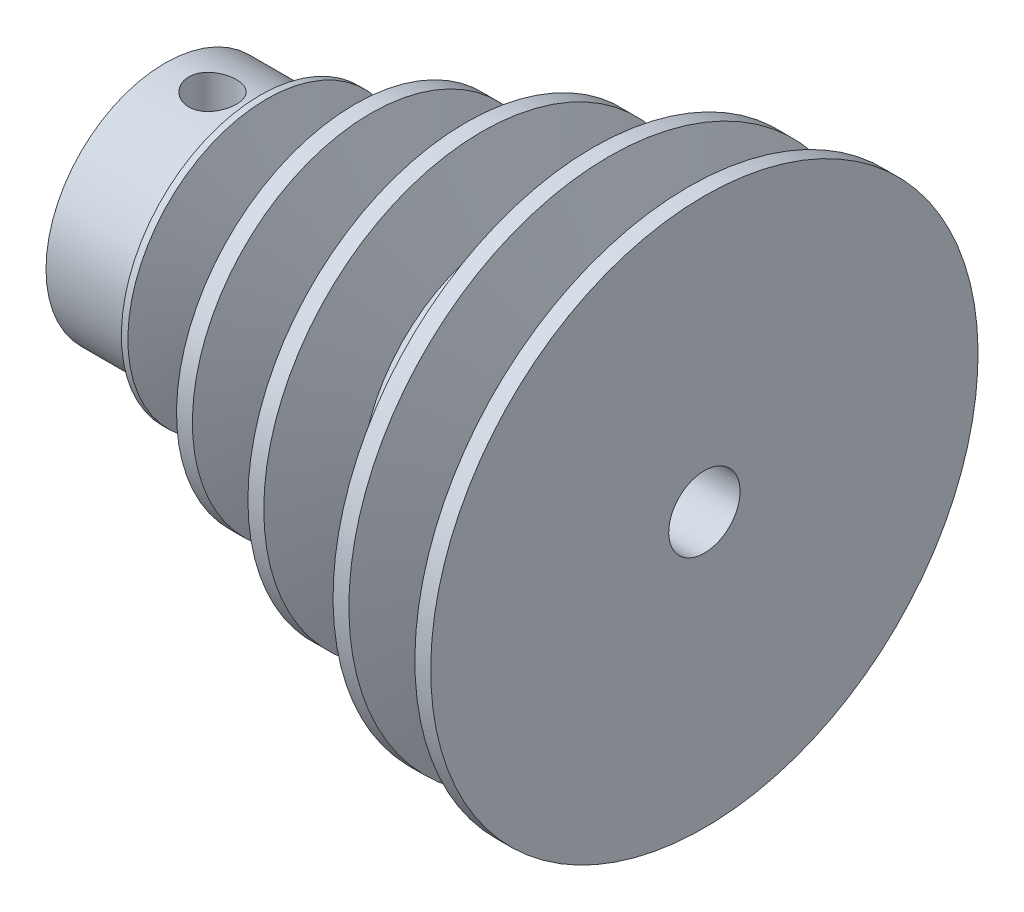
ISO-10303-21;
HEADER;
FILE_DESCRIPTION(('STEP AP214'),'2;1');
FILE_NAME('part.step','',(''),(''),'','','');
FILE_SCHEMA(('AUTOMOTIVE_DESIGN { 1 0 10303 214 1 1 1 1 }'));
ENDSEC;
DATA;
#1=APPLICATION_CONTEXT('core data for automotive mechanical design processes');
#2=APPLICATION_PROTOCOL_DEFINITION('international standard','automotive_design',2000,#1);
#3=PRODUCT_CONTEXT('',#1,'mechanical');
#4=PRODUCT('Part','Part','',(#3));
#5=PRODUCT_RELATED_PRODUCT_CATEGORY('part','',(#4));
#6=PRODUCT_DEFINITION_FORMATION('','',#4);
#7=PRODUCT_DEFINITION_CONTEXT('part definition',#1,'design');
#8=PRODUCT_DEFINITION('design','',#6,#7);
#9=PRODUCT_DEFINITION_SHAPE('','',#8);
#10=(LENGTH_UNIT() NAMED_UNIT(*) SI_UNIT(.MILLI.,.METRE.));
#11=(NAMED_UNIT(*) PLANE_ANGLE_UNIT() SI_UNIT($,.RADIAN.));
#12=(NAMED_UNIT(*) SI_UNIT($,.STERADIAN.) SOLID_ANGLE_UNIT());
#13=UNCERTAINTY_MEASURE_WITH_UNIT(LENGTH_MEASURE(1.E-05),#10,'distance_accuracy_value','');
#14=(GEOMETRIC_REPRESENTATION_CONTEXT(3) GLOBAL_UNCERTAINTY_ASSIGNED_CONTEXT((#13)) GLOBAL_UNIT_ASSIGNED_CONTEXT((#10,
#11,#12)) REPRESENTATION_CONTEXT('',''));
#15=CARTESIAN_POINT('',(0.,0.,0.));
#16=DIRECTION('',(0.,0.,1.));
#17=DIRECTION('',(1.,0.,0.));
#18=AXIS2_PLACEMENT_3D('',#15,#16,#17);
#19=CARTESIAN_POINT('',(0.,1.23931272015943,0.));
#20=DIRECTION('',(1.,0.,0.));
#21=DIRECTION('',(0.,1.,0.));
#22=AXIS2_PLACEMENT_3D('',#19,#20,#21);
#23=CYLINDRICAL_SURFACE('',#22,4.5);
#24=CARTESIAN_POINT('',(0.,1.23931272015943,0.));
#25=DIRECTION('',(1.,0.,0.));
#26=DIRECTION('',(0.,1.,0.));
#27=AXIS2_PLACEMENT_3D('',#24,#25,#26);
#28=CIRCLE('',#27,4.5);
#29=CARTESIAN_POINT('',(0.,5.73931272015943,0.));
#30=VERTEX_POINT('',#29);
#31=EDGE_CURVE('E10',#30,#30,#28,.T.);
#32=ORIENTED_EDGE('',*,*,#31,.F.);
#33=EDGE_LOOP('',(#32));
#34=FACE_BOUND('',#33,.T.);
#35=CARTESIAN_POINT('',(68.,1.23931272015944,0.));
#36=DIRECTION('',(1.,0.,0.));
#37=DIRECTION('',(0.,1.,0.));
#38=AXIS2_PLACEMENT_3D('',#35,#36,#37);
#39=CIRCLE('',#38,4.49999999999999);
#40=CARTESIAN_POINT('',(68.,5.73931272015943,0.));
#41=VERTEX_POINT('',#40);
#42=EDGE_CURVE('E51',#41,#41,#39,.T.);
#43=ORIENTED_EDGE('',*,*,#42,.T.);
#44=EDGE_LOOP('',(#43));
#45=FACE_BOUND('',#44,.T.);
#46=CARTESIAN_POINT('',(3.,5.73931272015943,0.));
#47=CARTESIAN_POINT('',(3.00000186573508,5.73931123886889,0.15072164959947));
#48=CARTESIAN_POINT('',(3.01142167582322,5.73167419712419,0.301452176851333));
#49=CARTESIAN_POINT('',(3.05639457492619,5.7018830711206,0.59810104158593));
#50=CARTESIAN_POINT('',(3.08995817181012,5.67972209486661,0.744017059910981));
#51=CARTESIAN_POINT('',(3.17716176796593,5.62306980594291,1.02631807461021));
#52=CARTESIAN_POINT('',(3.23070776159686,5.58863626217678,1.16274420495288));
#53=CARTESIAN_POINT('',(3.35559499331481,5.51020482870927,1.42412304054445));
#54=CARTESIAN_POINT('',(3.42693881510055,5.46620555047596,1.54907407635533));
#55=CARTESIAN_POINT('',(3.59198542161917,5.36772264851983,1.7959270197585));
#56=CARTESIAN_POINT('',(3.68707179530865,5.31266618056573,1.91667044973221));
#57=CARTESIAN_POINT('',(3.89359506878731,5.19904741969964,2.14159207551014));
#58=CARTESIAN_POINT('',(4.00505539355606,5.14048017645192,2.24574608557946));
#59=CARTESIAN_POINT('',(4.26157855280895,5.01523668925303,2.45133446337936));
#60=CARTESIAN_POINT('',(4.40916848017331,4.94873873893729,2.54974779469906));
#61=CARTESIAN_POINT('',(4.72254506610231,4.82557493074029,2.72025535595352));
#62=CARTESIAN_POINT('',(4.88829960226053,4.76889215954816,2.79239510156523));
#63=CARTESIAN_POINT('',(5.18506694019189,4.68895671973245,2.8901105250523));
#64=CARTESIAN_POINT('',(5.31229267932842,4.66077713852416,2.92311670850673));
#65=CARTESIAN_POINT('',(5.57211675709495,4.61818226507475,2.97225926681176));
#66=CARTESIAN_POINT('',(5.70470542307829,4.60374325135791,2.9884247197938));
#67=CARTESIAN_POINT('',(5.97221216829555,4.59086180424368,3.002870462104));
#68=CARTESIAN_POINT('',(6.10713753520439,4.5924847584124,3.00107764373871));
#69=CARTESIAN_POINT('',(6.37445246022382,4.61160935253547,2.97956372002451));
#70=CARTESIAN_POINT('',(6.50683977294976,4.62912444492503,2.95982742578818));
#71=CARTESIAN_POINT('',(6.75970057696874,4.6762205095701,2.90497491317742));
#72=CARTESIAN_POINT('',(6.88044200426452,4.70523504341825,2.87057567189679));
#73=CARTESIAN_POINT('',(7.11453553681584,4.77195706253868,2.78805177845537));
#74=CARTESIAN_POINT('',(7.22788519545557,4.80966740750797,2.73992260984511));
#75=CARTESIAN_POINT('',(7.46853809290249,4.89877566639455,2.62010728109712));
#76=CARTESIAN_POINT('',(7.59398985068898,4.95139748642152,2.54562078453565));
#77=CARTESIAN_POINT('',(7.83207509296433,5.0596857860081,2.3800344065443));
#78=CARTESIAN_POINT('',(7.94469248665353,5.11535596075473,2.28891403498575));
#79=CARTESIAN_POINT('',(8.17881381839246,5.23746287666952,2.06971747984493));
#80=CARTESIAN_POINT('',(8.29700107302078,5.30363389098225,1.93790907425758));
#81=CARTESIAN_POINT('',(8.50979474181109,5.42758423012319,1.65301199861739));
#82=CARTESIAN_POINT('',(8.60442321811428,5.48537138487659,1.49994344901489));
#83=CARTESIAN_POINT('',(8.75021657793366,5.57649378151768,1.20728674064533));
#84=CARTESIAN_POINT('',(8.80626504500823,5.61240163764327,1.07093646505802));
#85=CARTESIAN_POINT('',(8.89815738843823,5.67192850561616,0.789054065903088));
#86=CARTESIAN_POINT('',(8.93401834069837,5.69555790207238,0.643529818502444));
#87=CARTESIAN_POINT('',(8.98374174785695,5.72845095251175,0.346478179758469));
#88=CARTESIAN_POINT('',(8.99750919140739,5.73765255707728,0.194927717901261));
#89=CARTESIAN_POINT('',(9.00187063284333,5.74055944463657,-0.108662279084028));
#90=CARTESIAN_POINT('',(8.99246625073317,5.73426581094392,-0.260701779279956));
#91=CARTESIAN_POINT('',(8.95256391665706,5.70780656152354,-0.549683575806327));
#92=CARTESIAN_POINT('',(8.92359405336714,5.68864641601284,-0.686936167018703));
#93=CARTESIAN_POINT('',(8.84760647098074,5.63908945943196,-0.954174588641173));
#94=CARTESIAN_POINT('',(8.8005858736078,5.6086908563642,-1.08415925635699));
#95=CARTESIAN_POINT('',(8.68702155443251,5.53675800809685,-1.34199712569868));
#96=CARTESIAN_POINT('',(8.61946776887679,5.49466077219643,-1.46924427694593));
#97=CARTESIAN_POINT('',(8.46835006508103,5.40334055433186,-1.71102453593712));
#98=CARTESIAN_POINT('',(8.38477625920337,5.35411317621769,-1.82554972230581));
#99=CARTESIAN_POINT('',(8.18908819776187,5.24363091996186,-2.0577816822297));
#100=CARTESIAN_POINT('',(8.07455060987987,5.18170507216583,-2.17312781352281));
#101=CARTESIAN_POINT('',(7.82833285507184,5.05788031644486,-2.3840095210624));
#102=CARTESIAN_POINT('',(7.69664094136692,4.99598145641237,-2.479531404936));
#103=CARTESIAN_POINT('',(7.42928638082203,4.88340790473161,-2.6418716481687));
#104=CARTESIAN_POINT('',(7.2949019497142,4.83222667559331,-2.71043454162459));
#105=CARTESIAN_POINT('',(7.0141910214269,4.74089733410347,-2.82744320635816));
#106=CARTESIAN_POINT('',(6.86788659288638,4.70072940792725,-2.87592518617797));
#107=CARTESIAN_POINT('',(6.59315326892533,4.64331084304613,-2.94353765120495));
#108=CARTESIAN_POINT('',(6.46624228422316,4.62323769098172,-2.96637896084263));
#109=CARTESIAN_POINT('',(6.20914007898423,4.5975047162325,-2.99548809149845));
#110=CARTESIAN_POINT('',(6.0789525768549,4.59182923851309,-3.00177391409198));
#111=CARTESIAN_POINT('',(5.81903541134822,4.59577573927382,-2.99735881990096));
#112=CARTESIAN_POINT('',(5.68930606463311,4.60540677572879,-2.98664784488398));
#113=CARTESIAN_POINT('',(5.43398472052587,4.63846949924508,-2.94895499505287));
#114=CARTESIAN_POINT('',(5.30839847901947,4.66191959705786,-2.9219514129043));
#115=CARTESIAN_POINT('',(5.03143315726411,4.72721541167946,-2.84389536138181));
#116=CARTESIAN_POINT('',(4.88209816631783,4.772297861961,-2.78835207942162));
#117=CARTESIAN_POINT('',(4.5967700130633,4.8726449986075,-2.65626862210844));
#118=CARTESIAN_POINT('',(4.46079594912499,4.92792394462465,-2.57969896746294));
#119=CARTESIAN_POINT('',(4.20107615505149,5.04357104913194,-2.40597141606592));
#120=CARTESIAN_POINT('',(4.07759806232677,5.10401352815784,-2.3084641330428));
#121=CARTESIAN_POINT('',(3.84702010332391,5.2237352455,-2.09508703906086));
#122=CARTESIAN_POINT('',(3.73992527477759,5.28301412115219,-1.97921160224443));
#123=CARTESIAN_POINT('',(3.52991552489936,5.40379453211128,-1.71214106865834));
#124=CARTESIAN_POINT('',(3.42980707670461,5.46439376898915,-1.55826365805387));
#125=CARTESIAN_POINT('',(3.30100067172597,5.54436670298335,-1.31299166972123));
#126=CARTESIAN_POINT('',(3.2616260754404,5.5692023520911,-1.22882978620486));
#127=CARTESIAN_POINT('',(3.19053354071904,5.6145097004773,-1.05622318392368));
#128=CARTESIAN_POINT('',(3.1588129134786,5.6349829319569,-0.967779982313758));
#129=CARTESIAN_POINT('',(3.08830511061913,5.68080844524077,-0.737227179511898));
#130=CARTESIAN_POINT('',(3.05534334924084,5.70257716947672,-0.592538469527617));
#131=CARTESIAN_POINT('',(3.01119805075622,5.73182467267018,-0.298567051424194));
#132=CARTESIAN_POINT('',(2.9999981520131,5.7393141873589,-0.149287880489568));
#133=CARTESIAN_POINT('',(3.,5.73931272015943,0.));
#134=B_SPLINE_CURVE_WITH_KNOTS('',3,(#46,#47,#48,#49,#50,#51,#52,#53,#54,#55,#56,#57,#58,#59,
#60,#61,#62,#63,#64,#65,#66,#67,#68,#69,#70,#71,#72,#73,#74,#75,#76,#77,#78,#79,#80,#81,#82,#83,
#84,#85,#86,#87,#88,#89,#90,#91,#92,#93,#94,#95,#96,#97,#98,#99,#100,#101,#102,#103,#104,#105,
#106,#107,#108,#109,#110,#111,#112,#113,#114,#115,#116,#117,#118,#119,#120,#121,#122,#123,#124,
#125,#126,#127,#128,#129,#130,#131,#132,#133),.UNSPECIFIED.,.T.,.F.,(4,2,2,2,2,2,2,2,2,2,2,2,2,
2,2,2,2,2,2,2,2,2,2,2,2,2,2,2,2,2,2,2,2,2,2,2,2,2,2,2,2,2,2,4),(0.,0.451579839758099,
0.903374121523032,1.35306922978535,1.8028296580108,2.29075543500835,2.77938617406478,
3.34510024943973,3.90982958168158,4.31150540514044,4.71248651768713,5.11510067603067,
5.51805595895028,5.90323293302503,6.28853675717404,6.75221362001097,7.21646555679872,
7.78078431754915,8.3445726046183,8.79786131554923,9.25076602724006,9.70561324951163,
10.1604286730991,10.583296271985,11.0062313271719,11.4547852025406,11.9036168242759,
12.4234226422172,12.9435862977342,13.419749029665,13.8950493997087,14.2848607203399,
14.6742480050942,15.0638658043661,15.4540038578839,15.9480991306608,16.4428907007672,
16.9466886781651,17.4506412596501,18.0269302733763,18.3150447812807,18.603057928026,
19.0506787001148,19.4979627985071),.UNSPECIFIED.);
#135=CARTESIAN_POINT('',(3.,5.73931272015943,0.));
#136=VERTEX_POINT('',#135);
#137=EDGE_CURVE('E162',#136,#136,#134,.T.);
#138=ORIENTED_EDGE('',*,*,#137,.T.);
#139=EDGE_LOOP('',(#138));
#140=FACE_BOUND('',#139,.T.);
#141=ADVANCED_FACE('F37',(#34,#45,#140),#23,.F.);
#142=CARTESIAN_POINT('',(0.,1.23931272015943,0.));
#143=DIRECTION('',(1.,0.,0.));
#144=DIRECTION('',(0.,1.,0.));
#145=AXIS2_PLACEMENT_3D('',#142,#143,#144);
#146=CYLINDRICAL_SURFACE('',#145,15.);
#147=CARTESIAN_POINT('',(12.,1.23931272015943,0.));
#148=DIRECTION('',(1.,0.,0.));
#149=DIRECTION('',(0.,1.,0.));
#150=AXIS2_PLACEMENT_3D('',#147,#148,#149);
#151=CIRCLE('',#150,15.);
#152=CARTESIAN_POINT('',(12.,16.2393127201594,0.));
#153=VERTEX_POINT('',#152);
#154=EDGE_CURVE('E154',#153,#153,#151,.T.);
#155=ORIENTED_EDGE('',*,*,#154,.F.);
#156=EDGE_LOOP('',(#155));
#157=FACE_BOUND('',#156,.T.);
#158=CARTESIAN_POINT('',(0.,1.23931272015943,0.));
#159=DIRECTION('',(1.,0.,0.));
#160=DIRECTION('',(0.,1.,0.));
#161=AXIS2_PLACEMENT_3D('',#158,#159,#160);
#162=CIRCLE('',#161,15.);
#163=CARTESIAN_POINT('',(0.,16.2393127201594,0.));
#164=VERTEX_POINT('',#163);
#165=EDGE_CURVE('E158',#164,#164,#162,.T.);
#166=ORIENTED_EDGE('',*,*,#165,.T.);
#167=EDGE_LOOP('',(#166));
#168=FACE_BOUND('',#167,.T.);
#169=CARTESIAN_POINT('',(3.,16.2393127201594,0.));
#170=CARTESIAN_POINT('',(3.00000613349504,16.2393096475856,-0.1667307203779));
#171=CARTESIAN_POINT('',(3.01394652890294,16.2365042755064,-0.333538980604567));
#172=CARTESIAN_POINT('',(3.06929550034574,16.2255836888564,-0.662440523067058));
#173=CARTESIAN_POINT('',(3.11072589840453,16.217464255965,-0.824529952624068));
#174=CARTESIAN_POINT('',(3.21972382086237,16.196822198508,-1.13919091578994));
#175=CARTESIAN_POINT('',(3.28726631053407,16.184303792461,-1.2917714037994));
#176=CARTESIAN_POINT('',(3.44649674253389,16.1562246612189,-1.58342396659268));
#177=CARTESIAN_POINT('',(3.53818324682162,16.1406641172306,-1.72249684522744));
#178=CARTESIAN_POINT('',(3.74441548287431,16.1079776800585,-1.9850804319446));
#179=CARTESIAN_POINT('',(3.85922506617361,16.0908350852899,-2.10838185347557));
#180=CARTESIAN_POINT('',(4.10787724917511,16.0570381337371,-2.33411026982409));
#181=CARTESIAN_POINT('',(4.24172133400536,16.0403838151721,-2.43653563431127));
#182=CARTESIAN_POINT('',(4.52614857903563,16.0092859745379,-2.61849526004286));
#183=CARTESIAN_POINT('',(4.67687293138908,15.9948639411078,-2.6978128165976));
#184=CARTESIAN_POINT('',(4.98984545701224,15.970100761912,-2.82991699974093));
#185=CARTESIAN_POINT('',(5.15209249003904,15.9597592130183,-2.88270624731171));
#186=CARTESIAN_POINT('',(5.48125309172376,15.9444968777256,-2.95957589965448));
#187=CARTESIAN_POINT('',(5.64807763242668,15.9395068233751,-2.98402349387633));
#188=CARTESIAN_POINT('',(5.98352946409303,15.9353039719782,-3.00465638317836));
#189=CARTESIAN_POINT('',(6.15215656896044,15.9360905841947,-3.0008445681405));
#190=CARTESIAN_POINT('',(6.48374036406301,15.943289254605,-2.96536371930546));
#191=CARTESIAN_POINT('',(6.64674421688195,15.9496163059223,-2.93411562073172));
#192=CARTESIAN_POINT('',(6.96514822998901,15.9670491049595,-2.84531365386915));
#193=CARTESIAN_POINT('',(7.12054802675703,15.9781550808928,-2.78775852930204));
#194=CARTESIAN_POINT('',(7.4205457851108,16.0039812751717,-2.64757435102416));
#195=CARTESIAN_POINT('',(7.56506363870752,16.0187254145706,-2.56477845369634));
#196=CARTESIAN_POINT('',(7.83831254991845,16.0501512833513,-2.37658072371804));
#197=CARTESIAN_POINT('',(7.96704179055348,16.0668332353104,-2.27117629307049));
#198=CARTESIAN_POINT('',(8.20748820737081,16.1006233574033,-2.03849980368175));
#199=CARTESIAN_POINT('',(8.31885770357739,16.1177337964866,-1.91086848363733));
#200=CARTESIAN_POINT('',(8.51866153890368,16.1501781815917,-1.63855507218603));
#201=CARTESIAN_POINT('',(8.60709558388074,16.1655121048286,-1.49387276213817));
#202=CARTESIAN_POINT('',(8.75858252767793,16.192713424986,-1.19117816063676));
#203=CARTESIAN_POINT('',(8.82159568093362,16.2045753856076,-1.0331454587559));
#204=CARTESIAN_POINT('',(8.9200814221157,16.2234549897952,-0.708446929345994));
#205=CARTESIAN_POINT('',(8.95555734622089,16.2304732201754,-0.541782150217349));
#206=CARTESIAN_POINT('',(8.99746936138284,16.2387928761655,-0.207538216881452));
#207=CARTESIAN_POINT('',(9.00438125862081,16.2401879597335,-0.040020984976729));
#208=CARTESIAN_POINT('',(8.99025042317346,16.2373642780625,0.293774802578142));
#209=CARTESIAN_POINT('',(8.96920926194222,16.2331458284028,0.460053427331379));
#210=CARTESIAN_POINT('',(8.90016487936814,16.2196276804,0.785116979839622));
#211=CARTESIAN_POINT('',(8.8524057945063,16.2103740122856,0.943955845019709));
#212=CARTESIAN_POINT('',(8.73154805203258,16.1878192819904,1.251370882499));
#213=CARTESIAN_POINT('',(8.65844749596952,16.1745179165862,1.39994628491262));
#214=CARTESIAN_POINT('',(8.48795252804607,16.1451100661583,1.68462352105865));
#215=CARTESIAN_POINT('',(8.39027165688317,16.128971233271,1.82055038025657));
#216=CARTESIAN_POINT('',(8.17377242637816,16.0957547650559,2.07425405735762));
#217=CARTESIAN_POINT('',(8.0549518008004,16.0786770292111,2.19202892679229));
#218=CARTESIAN_POINT('',(7.79737994432663,16.0451918268684,2.40792177232253));
#219=CARTESIAN_POINT('',(7.65835276733599,16.0287985271586,2.50571310734597));
#220=CARTESIAN_POINT('',(7.36556591592997,15.9988384740453,2.67655626015362));
#221=CARTESIAN_POINT('',(7.21180683127935,15.9852716075597,2.74960906776871));
#222=CARTESIAN_POINT('',(6.89469526155136,15.9626149376909,2.86845552474588));
#223=CARTESIAN_POINT('',(6.73139747636905,15.953501966325,2.91439049937315));
#224=CARTESIAN_POINT('',(6.39919963952729,15.9407358239202,2.97812595488159));
#225=CARTESIAN_POINT('',(6.23030032137196,15.9370819408928,2.99593010467534));
#226=CARTESIAN_POINT('',(5.89497340636705,15.9356872091008,3.00276273260241));
#227=CARTESIAN_POINT('',(5.72855655321898,15.9378402958385,2.99230736421269));
#228=CARTESIAN_POINT('',(5.39990505028493,15.9475799246978,2.94405691230018));
#229=CARTESIAN_POINT('',(5.23767036691559,15.9551664231745,2.9062620483879));
#230=CARTESIAN_POINT('',(4.92231686627837,15.9748706467342,2.80463570549686));
#231=CARTESIAN_POINT('',(4.76917691849276,15.9869773507243,2.74086752015203));
#232=CARTESIAN_POINT('',(4.47568883779668,16.0143641693845,2.58916393380481));
#233=CARTESIAN_POINT('',(4.33534177882459,16.0296445501263,2.50122650632465));
#234=CARTESIAN_POINT('',(4.06885328354906,16.0619815358562,2.30191774435924));
#235=CARTESIAN_POINT('',(3.94299370419722,16.0790639074504,2.19017366170554));
#236=CARTESIAN_POINT('',(3.71164138341249,16.1128951763181,1.94719310703942));
#237=CARTESIAN_POINT('',(3.60615332904819,16.129643996055,1.81595216146001));
#238=CARTESIAN_POINT('',(3.41749606816066,16.1611276917986,1.53605288726474));
#239=CARTESIAN_POINT('',(3.33457199015993,16.1758396567368,1.3872266532895));
#240=CARTESIAN_POINT('',(3.19504163221023,16.2013664727094,1.0774990828222));
#241=CARTESIAN_POINT('',(3.13841163140253,16.2121848343179,0.916608782589379));
#242=CARTESIAN_POINT('',(3.06404415586585,16.2266038980205,0.629464466771339));
#243=CARTESIAN_POINT('',(3.04007041887673,16.231341814913,0.504844992041354));
#244=CARTESIAN_POINT('',(3.00804626292491,16.2376973443562,0.253498575630201));
#245=CARTESIAN_POINT('',(2.9999953364707,16.2393150563541,0.126771701245857));
#246=CARTESIAN_POINT('',(3.,16.2393127201594,0.));
#247=B_SPLINE_CURVE_WITH_KNOTS('',3,(#169,#170,#171,#172,#173,#174,#175,#176,#177,#178,#179,
#180,#181,#182,#183,#184,#185,#186,#187,#188,#189,#190,#191,#192,#193,#194,#195,#196,#197,#198,
#199,#200,#201,#202,#203,#204,#205,#206,#207,#208,#209,#210,#211,#212,#213,#214,#215,#216,#217,
#218,#219,#220,#221,#222,#223,#224,#225,#226,#227,#228,#229,#230,#231,#232,#233,#234,#235,#236,
#237,#238,#239,#240,#241,#242,#243,#244,#245,#246),.UNSPECIFIED.,.T.,.F.,(4,2,2,2,2,2,2,2,2,2,2,
2,2,2,2,2,2,2,2,2,2,2,2,2,2,2,2,2,2,2,2,2,2,2,2,2,2,2,4),(0.,0.499728391983776,0.99985395207397,
1.49950120575103,1.99911870669259,2.50479801033656,3.0105167902421,3.52083585017768,
4.03110448095593,4.53468555310762,5.03821512843676,5.53415181018835,6.03011217761189,
6.52942470610778,7.02879464249012,7.53714757474052,8.04550702619461,8.55465824562072,
9.06374777094108,9.56432207028796,10.064868229736,10.5609136185217,11.0569961764807,
11.5591519810008,12.0613616503779,12.5712188573768,13.081055661704,13.5882114309817,
14.0953010499124,14.593191677031,15.0910783047783,15.5877588375933,16.084481027456,
16.5896422871743,17.0949196359879,17.6054849002691,18.1155886655256,18.4955632586968,
18.8755257411299),.UNSPECIFIED.);
#248=CARTESIAN_POINT('',(3.,16.2393127201594,0.));
#249=VERTEX_POINT('',#248);
#250=EDGE_CURVE('E41',#249,#249,#247,.T.);
#251=ORIENTED_EDGE('',*,*,#250,.T.);
#252=EDGE_LOOP('',(#251));
#253=FACE_BOUND('',#252,.T.);
#254=ADVANCED_FACE('F175',(#157,#168,#253),#146,.T.);
#255=CARTESIAN_POINT('',(0.,16.2393127201594,0.));
#256=DIRECTION('',(-1.,0.,0.));
#257=DIRECTION('',(0.,-1.,0.));
#258=AXIS2_PLACEMENT_3D('',#255,#256,#257);
#259=PLANE('',#258);
#260=ORIENTED_EDGE('',*,*,#31,.T.);
#261=EDGE_LOOP('',(#260));
#262=FACE_BOUND('',#261,.T.);
#263=ORIENTED_EDGE('',*,*,#165,.F.);
#264=EDGE_LOOP('',(#263));
#265=FACE_BOUND('',#264,.T.);
#266=ADVANCED_FACE('F39',(#262,#265),#259,.T.);
#267=CARTESIAN_POINT('',(68.,5.73931272015943,0.));
#268=DIRECTION('',(1.,0.,0.));
#269=DIRECTION('',(0.,1.,0.));
#270=AXIS2_PLACEMENT_3D('',#267,#268,#269);
#271=PLANE('',#270);
#272=CARTESIAN_POINT('',(68.,1.23931272015944,0.));
#273=DIRECTION('',(1.,0.,0.));
#274=DIRECTION('',(0.,1.,0.));
#275=AXIS2_PLACEMENT_3D('',#272,#273,#274);
#276=CIRCLE('',#275,34.5);
#277=CARTESIAN_POINT('',(68.,35.7393127201594,0.));
#278=VERTEX_POINT('',#277);
#279=EDGE_CURVE('E56',#278,#278,#276,.T.);
#280=ORIENTED_EDGE('',*,*,#279,.T.);
#281=EDGE_LOOP('',(#280));
#282=FACE_BOUND('',#281,.T.);
#283=ORIENTED_EDGE('',*,*,#42,.F.);
#284=EDGE_LOOP('',(#283));
#285=FACE_BOUND('',#284,.T.);
#286=ADVANCED_FACE('F274',(#282,#285),#271,.T.);
#287=CARTESIAN_POINT('',(0.,1.23931272015943,0.));
#288=DIRECTION('',(1.,0.,0.));
#289=DIRECTION('',(0.,1.,0.));
#290=AXIS2_PLACEMENT_3D('',#287,#288,#289);
#291=CYLINDRICAL_SURFACE('',#290,34.5);
#292=CARTESIAN_POINT('',(66.,1.23931272015944,0.));
#293=DIRECTION('',(1.,0.,0.));
#294=DIRECTION('',(0.,1.,0.));
#295=AXIS2_PLACEMENT_3D('',#292,#293,#294);
#296=CIRCLE('',#295,34.5);
#297=CARTESIAN_POINT('',(66.,35.7393127201594,0.));
#298=VERTEX_POINT('',#297);
#299=EDGE_CURVE('E62',#298,#298,#296,.T.);
#300=ORIENTED_EDGE('',*,*,#299,.T.);
#301=EDGE_LOOP('',(#300));
#302=FACE_BOUND('',#301,.T.);
#303=ORIENTED_EDGE('',*,*,#279,.F.);
#304=EDGE_LOOP('',(#303));
#305=FACE_BOUND('',#304,.T.);
#306=ADVANCED_FACE('F271',(#302,#305),#291,.T.);
#307=CARTESIAN_POINT('',(66.,1.23931272015944,0.));
#308=DIRECTION('',(1.,0.,0.));
#309=DIRECTION('',(0.,1.,0.));
#310=AXIS2_PLACEMENT_3D('',#307,#308,#309);
#311=CONICAL_SURFACE('',#310,34.5,1.22173047639604);
#312=CARTESIAN_POINT('',(62.3602976573381,1.23931272015944,0.));
#313=DIRECTION('',(1.,0.,0.));
#314=DIRECTION('',(0.,1.,0.));
#315=AXIS2_PLACEMENT_3D('',#312,#313,#314);
#316=CIRCLE('',#315,24.5);
#317=CARTESIAN_POINT('',(62.3602976573381,25.7393127201594,0.));
#318=VERTEX_POINT('',#317);
#319=EDGE_CURVE('E66',#318,#318,#316,.T.);
#320=ORIENTED_EDGE('',*,*,#319,.T.);
#321=EDGE_LOOP('',(#320));
#322=FACE_BOUND('',#321,.T.);
#323=ORIENTED_EDGE('',*,*,#299,.F.);
#324=EDGE_LOOP('',(#323));
#325=FACE_BOUND('',#324,.T.);
#326=ADVANCED_FACE('F267',(#322,#325),#311,.T.);
#327=CARTESIAN_POINT('',(0.,1.23931272015943,0.));
#328=DIRECTION('',(1.,0.,0.));
#329=DIRECTION('',(0.,1.,0.));
#330=AXIS2_PLACEMENT_3D('',#327,#328,#329);
#331=CYLINDRICAL_SURFACE('',#330,24.5);
#332=CARTESIAN_POINT('',(58.9937605110017,1.23931272015944,0.));
#333=DIRECTION('',(1.,0.,0.));
#334=DIRECTION('',(0.,1.,0.));
#335=AXIS2_PLACEMENT_3D('',#332,#333,#334);
#336=CIRCLE('',#335,24.5);
#337=CARTESIAN_POINT('',(58.9937605110017,25.7393127201594,0.));
#338=VERTEX_POINT('',#337);
#339=EDGE_CURVE('E70',#338,#338,#336,.T.);
#340=ORIENTED_EDGE('',*,*,#339,.T.);
#341=EDGE_LOOP('',(#340));
#342=FACE_BOUND('',#341,.T.);
#343=ORIENTED_EDGE('',*,*,#319,.F.);
#344=EDGE_LOOP('',(#343));
#345=FACE_BOUND('',#344,.T.);
#346=ADVANCED_FACE('F263',(#342,#345),#331,.T.);
#347=CARTESIAN_POINT('',(58.9937605110017,1.23931272015944,0.));
#348=DIRECTION('',(-1.,0.,0.));
#349=DIRECTION('',(0.,-1.,0.));
#350=AXIS2_PLACEMENT_3D('',#347,#348,#349);
#351=CONICAL_SURFACE('',#350,24.5,1.22173047639603);
#352=CARTESIAN_POINT('',(55.975766287674,1.23931272015944,0.));
#353=DIRECTION('',(1.,0.,0.));
#354=DIRECTION('',(0.,1.,0.));
#355=AXIS2_PLACEMENT_3D('',#352,#353,#354);
#356=CIRCLE('',#355,32.7918709806373);
#357=CARTESIAN_POINT('',(55.975766287674,34.0311837007967,0.));
#358=VERTEX_POINT('',#357);
#359=EDGE_CURVE('E74',#358,#358,#356,.T.);
#360=ORIENTED_EDGE('',*,*,#359,.T.);
#361=EDGE_LOOP('',(#360));
#362=FACE_BOUND('',#361,.T.);
#363=ORIENTED_EDGE('',*,*,#339,.F.);
#364=EDGE_LOOP('',(#363));
#365=FACE_BOUND('',#364,.T.);
#366=ADVANCED_FACE('F259',(#362,#365),#351,.T.);
#367=CARTESIAN_POINT('',(0.,1.23931272015943,0.));
#368=DIRECTION('',(1.,0.,0.));
#369=DIRECTION('',(0.,1.,0.));
#370=AXIS2_PLACEMENT_3D('',#367,#368,#369);
#371=CYLINDRICAL_SURFACE('',#370,32.7918709806373);
#372=CARTESIAN_POINT('',(53.975766287674,1.23931272015944,0.));
#373=DIRECTION('',(1.,0.,0.));
#374=DIRECTION('',(0.,1.,0.));
#375=AXIS2_PLACEMENT_3D('',#372,#373,#374);
#376=CIRCLE('',#375,32.7918709806373);
#377=CARTESIAN_POINT('',(53.975766287674,34.0311837007967,0.));
#378=VERTEX_POINT('',#377);
#379=EDGE_CURVE('E78',#378,#378,#376,.T.);
#380=ORIENTED_EDGE('',*,*,#379,.T.);
#381=EDGE_LOOP('',(#380));
#382=FACE_BOUND('',#381,.T.);
#383=ORIENTED_EDGE('',*,*,#359,.F.);
#384=EDGE_LOOP('',(#383));
#385=FACE_BOUND('',#384,.T.);
#386=ADVANCED_FACE('F255',(#382,#385),#371,.T.);
#387=CARTESIAN_POINT('',(53.975766287674,34.0311837007967,0.));
#388=DIRECTION('',(-1.,0.,0.));
#389=DIRECTION('',(0.,-1.,0.));
#390=AXIS2_PLACEMENT_3D('',#387,#388,#389);
#391=PLANE('',#390);
#392=CARTESIAN_POINT('',(53.975766287674,1.23931272015944,0.));
#393=DIRECTION('',(1.,0.,0.));
#394=DIRECTION('',(0.,1.,0.));
#395=AXIS2_PLACEMENT_3D('',#392,#393,#394);
#396=CIRCLE('',#395,25.068403955534);
#397=CARTESIAN_POINT('',(53.975766287674,26.3077166756935,0.));
#398=VERTEX_POINT('',#397);
#399=EDGE_CURVE('E82',#398,#398,#396,.T.);
#400=ORIENTED_EDGE('',*,*,#399,.T.);
#401=EDGE_LOOP('',(#400));
#402=FACE_BOUND('',#401,.T.);
#403=ORIENTED_EDGE('',*,*,#379,.F.);
#404=EDGE_LOOP('',(#403));
#405=FACE_BOUND('',#404,.T.);
#406=ADVANCED_FACE('F251',(#402,#405),#391,.T.);
#407=CARTESIAN_POINT('',(0.,1.23931272015943,0.));
#408=DIRECTION('',(1.,0.,0.));
#409=DIRECTION('',(0.,1.,0.));
#410=AXIS2_PLACEMENT_3D('',#407,#408,#409);
#411=CYLINDRICAL_SURFACE('',#410,25.068403955534);
#412=CARTESIAN_POINT('',(51.6199651109924,1.23931272015944,0.));
#413=DIRECTION('',(1.,0.,0.));
#414=DIRECTION('',(0.,1.,0.));
#415=AXIS2_PLACEMENT_3D('',#412,#413,#414);
#416=CIRCLE('',#415,25.068403955534);
#417=CARTESIAN_POINT('',(51.6199651109924,26.3077166756935,0.));
#418=VERTEX_POINT('',#417);
#419=EDGE_CURVE('E86',#418,#418,#416,.T.);
#420=ORIENTED_EDGE('',*,*,#419,.T.);
#421=EDGE_LOOP('',(#420));
#422=FACE_BOUND('',#421,.T.);
#423=ORIENTED_EDGE('',*,*,#399,.F.);
#424=EDGE_LOOP('',(#423));
#425=FACE_BOUND('',#424,.T.);
#426=ADVANCED_FACE('F247',(#422,#425),#411,.T.);
#427=CARTESIAN_POINT('',(51.6199651109924,1.23931272015944,0.));
#428=DIRECTION('',(1.,0.,0.));
#429=DIRECTION('',(0.,1.,0.));
#430=AXIS2_PLACEMENT_3D('',#427,#428,#429);
#431=CONICAL_SURFACE('',#430,25.068403955534,1.22173047639604);
#432=CARTESIAN_POINT('',(49.2292615845417,1.23931272015944,0.));
#433=DIRECTION('',(1.,0.,0.));
#434=DIRECTION('',(0.,1.,0.));
#435=AXIS2_PLACEMENT_3D('',#432,#433,#434);
#436=CIRCLE('',#435,18.5);
#437=CARTESIAN_POINT('',(49.2292615845417,19.7393127201594,0.));
#438=VERTEX_POINT('',#437);
#439=EDGE_CURVE('E90',#438,#438,#436,.T.);
#440=ORIENTED_EDGE('',*,*,#439,.T.);
#441=EDGE_LOOP('',(#440));
#442=FACE_BOUND('',#441,.T.);
#443=ORIENTED_EDGE('',*,*,#419,.F.);
#444=EDGE_LOOP('',(#443));
#445=FACE_BOUND('',#444,.T.);
#446=ADVANCED_FACE('F243',(#442,#445),#431,.T.);
#447=CARTESIAN_POINT('',(0.,1.23931272015943,0.));
#448=DIRECTION('',(1.,0.,0.));
#449=DIRECTION('',(0.,1.,0.));
#450=AXIS2_PLACEMENT_3D('',#447,#448,#449);
#451=CYLINDRICAL_SURFACE('',#450,18.5);
#452=CARTESIAN_POINT('',(43.2292615845417,1.23931272015944,0.));
#453=DIRECTION('',(1.,0.,0.));
#454=DIRECTION('',(0.,1.,0.));
#455=AXIS2_PLACEMENT_3D('',#452,#453,#454);
#456=CIRCLE('',#455,18.5);
#457=CARTESIAN_POINT('',(43.2292615845417,19.7393127201594,0.));
#458=VERTEX_POINT('',#457);
#459=EDGE_CURVE('E94',#458,#458,#456,.T.);
#460=ORIENTED_EDGE('',*,*,#459,.T.);
#461=EDGE_LOOP('',(#460));
#462=FACE_BOUND('',#461,.T.);
#463=ORIENTED_EDGE('',*,*,#439,.F.);
#464=EDGE_LOOP('',(#463));
#465=FACE_BOUND('',#464,.T.);
#466=ADVANCED_FACE('F239',(#462,#465),#451,.T.);
#467=CARTESIAN_POINT('',(43.2292615845417,1.23931272015944,0.));
#468=DIRECTION('',(-1.,0.,0.));
#469=DIRECTION('',(0.,-1.,0.));
#470=AXIS2_PLACEMENT_3D('',#467,#468,#469);
#471=CONICAL_SURFACE('',#470,18.5,1.22173047639603);
#472=CARTESIAN_POINT('',(39.9535294761458,1.23931272015944,0.));
#473=DIRECTION('',(1.,0.,0.));
#474=DIRECTION('',(0.,1.,0.));
#475=AXIS2_PLACEMENT_3D('',#472,#473,#474);
#476=CIRCLE('',#475,27.5);
#477=CARTESIAN_POINT('',(39.9535294761458,28.7393127201594,0.));
#478=VERTEX_POINT('',#477);
#479=EDGE_CURVE('E98',#478,#478,#476,.T.);
#480=ORIENTED_EDGE('',*,*,#479,.T.);
#481=EDGE_LOOP('',(#480));
#482=FACE_BOUND('',#481,.T.);
#483=ORIENTED_EDGE('',*,*,#459,.F.);
#484=EDGE_LOOP('',(#483));
#485=FACE_BOUND('',#484,.T.);
#486=ADVANCED_FACE('F235',(#482,#485),#471,.T.);
#487=CARTESIAN_POINT('',(0.,1.23931272015943,0.));
#488=DIRECTION('',(1.,0.,0.));
#489=DIRECTION('',(0.,1.,0.));
#490=AXIS2_PLACEMENT_3D('',#487,#488,#489);
#491=CYLINDRICAL_SURFACE('',#490,27.5);
#492=CARTESIAN_POINT('',(37.9535294761458,1.23931272015944,0.));
#493=DIRECTION('',(1.,0.,0.));
#494=DIRECTION('',(0.,1.,0.));
#495=AXIS2_PLACEMENT_3D('',#492,#493,#494);
#496=CIRCLE('',#495,27.5);
#497=CARTESIAN_POINT('',(37.9535294761458,28.7393127201594,0.));
#498=VERTEX_POINT('',#497);
#499=EDGE_CURVE('E102',#498,#498,#496,.T.);
#500=ORIENTED_EDGE('',*,*,#499,.T.);
#501=EDGE_LOOP('',(#500));
#502=FACE_BOUND('',#501,.T.);
#503=ORIENTED_EDGE('',*,*,#479,.F.);
#504=EDGE_LOOP('',(#503));
#505=FACE_BOUND('',#504,.T.);
#506=ADVANCED_FACE('F231',(#502,#505),#491,.T.);
#507=CARTESIAN_POINT('',(37.9535294761458,28.7393127201594,0.));
#508=DIRECTION('',(-1.,0.,0.));
#509=DIRECTION('',(0.,-1.,0.));
#510=AXIS2_PLACEMENT_3D('',#507,#508,#509);
#511=PLANE('',#510);
#512=CARTESIAN_POINT('',(37.9535294761458,1.23931272015944,0.));
#513=DIRECTION('',(1.,0.,0.));
#514=DIRECTION('',(0.,1.,0.));
#515=AXIS2_PLACEMENT_3D('',#512,#513,#514);
#516=CIRCLE('',#515,18.4231220337054);
#517=CARTESIAN_POINT('',(37.9535294761458,19.6624347538649,0.));
#518=VERTEX_POINT('',#517);
#519=EDGE_CURVE('E106',#518,#518,#516,.T.);
#520=ORIENTED_EDGE('',*,*,#519,.T.);
#521=EDGE_LOOP('',(#520));
#522=FACE_BOUND('',#521,.T.);
#523=ORIENTED_EDGE('',*,*,#499,.F.);
#524=EDGE_LOOP('',(#523));
#525=FACE_BOUND('',#524,.T.);
#526=ADVANCED_FACE('F227',(#522,#525),#511,.T.);
#527=CARTESIAN_POINT('',(0.,1.23931272015943,0.));
#528=DIRECTION('',(1.,0.,0.));
#529=DIRECTION('',(0.,1.,0.));
#530=AXIS2_PLACEMENT_3D('',#527,#528,#529);
#531=CYLINDRICAL_SURFACE('',#530,18.4231220337054);
#532=CARTESIAN_POINT('',(34.5880660233559,1.23931272015944,0.));
#533=DIRECTION('',(1.,0.,0.));
#534=DIRECTION('',(0.,1.,0.));
#535=AXIS2_PLACEMENT_3D('',#532,#533,#534);
#536=CIRCLE('',#535,18.4231220337054);
#537=CARTESIAN_POINT('',(34.5880660233559,19.6624347538649,0.));
#538=VERTEX_POINT('',#537);
#539=EDGE_CURVE('E110',#538,#538,#536,.T.);
#540=ORIENTED_EDGE('',*,*,#539,.T.);
#541=EDGE_LOOP('',(#540));
#542=FACE_BOUND('',#541,.T.);
#543=ORIENTED_EDGE('',*,*,#519,.F.);
#544=EDGE_LOOP('',(#543));
#545=FACE_BOUND('',#544,.T.);
#546=ADVANCED_FACE('F223',(#542,#545),#531,.T.);
#547=CARTESIAN_POINT('',(34.5880660233559,1.23931272015944,0.));
#548=DIRECTION('',(1.,0.,0.));
#549=DIRECTION('',(0.,1.,0.));
#550=AXIS2_PLACEMENT_3D('',#547,#548,#549);
#551=CONICAL_SURFACE('',#550,18.4231220337054,1.22173047639604);
#552=CARTESIAN_POINT('',(32.4322259091608,1.23931272015944,0.));
#553=DIRECTION('',(1.,0.,0.));
#554=DIRECTION('',(0.,1.,0.));
#555=AXIS2_PLACEMENT_3D('',#552,#553,#554);
#556=CIRCLE('',#555,12.5);
#557=CARTESIAN_POINT('',(32.4322259091608,13.7393127201594,0.));
#558=VERTEX_POINT('',#557);
#559=EDGE_CURVE('E114',#558,#558,#556,.T.);
#560=ORIENTED_EDGE('',*,*,#559,.T.);
#561=EDGE_LOOP('',(#560));
#562=FACE_BOUND('',#561,.T.);
#563=ORIENTED_EDGE('',*,*,#539,.F.);
#564=EDGE_LOOP('',(#563));
#565=FACE_BOUND('',#564,.T.);
#566=ADVANCED_FACE('F219',(#562,#565),#551,.T.);
#567=CARTESIAN_POINT('',(0.,1.23931272015943,0.));
#568=DIRECTION('',(1.,0.,0.));
#569=DIRECTION('',(0.,1.,0.));
#570=AXIS2_PLACEMENT_3D('',#567,#568,#569);
#571=CYLINDRICAL_SURFACE('',#570,12.5);
#572=CARTESIAN_POINT('',(29.5932318188079,1.23931272015943,0.));
#573=DIRECTION('',(1.,0.,0.));
#574=DIRECTION('',(0.,1.,0.));
#575=AXIS2_PLACEMENT_3D('',#572,#573,#574);
#576=CIRCLE('',#575,12.5);
#577=CARTESIAN_POINT('',(29.5932318188079,13.7393127201594,0.));
#578=VERTEX_POINT('',#577);
#579=EDGE_CURVE('E118',#578,#578,#576,.T.);
#580=ORIENTED_EDGE('',*,*,#579,.T.);
#581=EDGE_LOOP('',(#580));
#582=FACE_BOUND('',#581,.T.);
#583=ORIENTED_EDGE('',*,*,#559,.F.);
#584=EDGE_LOOP('',(#583));
#585=FACE_BOUND('',#584,.T.);
#586=ADVANCED_FACE('F215',(#582,#585),#571,.T.);
#587=CARTESIAN_POINT('',(29.5932318188079,1.23931272015943,0.));
#588=DIRECTION('',(-1.,0.,0.));
#589=DIRECTION('',(0.,-1.,0.));
#590=AXIS2_PLACEMENT_3D('',#587,#588,#589);
#591=CONICAL_SURFACE('',#590,12.5,1.22173047639603);
#592=CARTESIAN_POINT('',(25.9535294761458,1.23931272015943,0.));
#593=DIRECTION('',(1.,0.,0.));
#594=DIRECTION('',(0.,1.,0.));
#595=AXIS2_PLACEMENT_3D('',#592,#593,#594);
#596=CIRCLE('',#595,22.5);
#597=CARTESIAN_POINT('',(25.9535294761458,23.7393127201594,0.));
#598=VERTEX_POINT('',#597);
#599=EDGE_CURVE('E122',#598,#598,#596,.T.);
#600=ORIENTED_EDGE('',*,*,#599,.T.);
#601=EDGE_LOOP('',(#600));
#602=FACE_BOUND('',#601,.T.);
#603=ORIENTED_EDGE('',*,*,#579,.F.);
#604=EDGE_LOOP('',(#603));
#605=FACE_BOUND('',#604,.T.);
#606=ADVANCED_FACE('F211',(#602,#605),#591,.T.);
#607=CARTESIAN_POINT('',(0.,1.23931272015943,0.));
#608=DIRECTION('',(1.,0.,0.));
#609=DIRECTION('',(0.,1.,0.));
#610=AXIS2_PLACEMENT_3D('',#607,#608,#609);
#611=CYLINDRICAL_SURFACE('',#610,22.5);
#612=CARTESIAN_POINT('',(23.9535294761458,1.23931272015943,0.));
#613=DIRECTION('',(1.,0.,0.));
#614=DIRECTION('',(0.,1.,0.));
#615=AXIS2_PLACEMENT_3D('',#612,#613,#614);
#616=CIRCLE('',#615,22.5);
#617=CARTESIAN_POINT('',(23.9535294761458,23.7393127201594,0.));
#618=VERTEX_POINT('',#617);
#619=EDGE_CURVE('E126',#618,#618,#616,.T.);
#620=ORIENTED_EDGE('',*,*,#619,.T.);
#621=EDGE_LOOP('',(#620));
#622=FACE_BOUND('',#621,.T.);
#623=ORIENTED_EDGE('',*,*,#599,.F.);
#624=EDGE_LOOP('',(#623));
#625=FACE_BOUND('',#624,.T.);
#626=ADVANCED_FACE('F207',(#622,#625),#611,.T.);
#627=CARTESIAN_POINT('',(23.9535294761458,23.7393127201594,0.));
#628=DIRECTION('',(-1.,0.,0.));
#629=DIRECTION('',(0.,-1.,0.));
#630=AXIS2_PLACEMENT_3D('',#627,#628,#629);
#631=PLANE('',#630);
#632=CARTESIAN_POINT('',(23.9535294761458,1.23931272015943,0.));
#633=DIRECTION('',(1.,0.,0.));
#634=DIRECTION('',(0.,1.,0.));
#635=AXIS2_PLACEMENT_3D('',#632,#633,#634);
#636=CIRCLE('',#635,20.);
#637=CARTESIAN_POINT('',(23.9535294761458,21.2393127201594,0.));
#638=VERTEX_POINT('',#637);
#639=EDGE_CURVE('E130',#638,#638,#636,.T.);
#640=ORIENTED_EDGE('',*,*,#639,.T.);
#641=EDGE_LOOP('',(#640));
#642=FACE_BOUND('',#641,.T.);
#643=ORIENTED_EDGE('',*,*,#619,.F.);
#644=EDGE_LOOP('',(#643));
#645=FACE_BOUND('',#644,.T.);
#646=ADVANCED_FACE('F203',(#642,#645),#631,.T.);
#647=CARTESIAN_POINT('',(0.,1.23931272015943,0.));
#648=DIRECTION('',(1.,0.,0.));
#649=DIRECTION('',(0.,1.,0.));
#650=AXIS2_PLACEMENT_3D('',#647,#648,#649);
#651=CYLINDRICAL_SURFACE('',#650,20.);
#652=CARTESIAN_POINT('',(22.9014154743689,1.23931272015943,0.));
#653=DIRECTION('',(1.,0.,0.));
#654=DIRECTION('',(0.,1.,0.));
#655=AXIS2_PLACEMENT_3D('',#652,#653,#654);
#656=CIRCLE('',#655,20.);
#657=CARTESIAN_POINT('',(22.9014154743689,21.2393127201594,0.));
#658=VERTEX_POINT('',#657);
#659=EDGE_CURVE('E134',#658,#658,#656,.T.);
#660=ORIENTED_EDGE('',*,*,#659,.T.);
#661=EDGE_LOOP('',(#660));
#662=FACE_BOUND('',#661,.T.);
#663=ORIENTED_EDGE('',*,*,#639,.F.);
#664=EDGE_LOOP('',(#663));
#665=FACE_BOUND('',#664,.T.);
#666=ADVANCED_FACE('F199',(#662,#665),#651,.T.);
#667=CARTESIAN_POINT('',(22.9014154743689,1.23931272015943,0.));
#668=DIRECTION('',(1.,0.,0.));
#669=DIRECTION('',(0.,1.,0.));
#670=AXIS2_PLACEMENT_3D('',#667,#668,#669);
#671=CONICAL_SURFACE('',#670,20.,1.22173047639604);
#672=CARTESIAN_POINT('',(18.8977428974407,1.23931272015943,0.));
#673=DIRECTION('',(1.,0.,0.));
#674=DIRECTION('',(0.,1.,0.));
#675=AXIS2_PLACEMENT_3D('',#672,#673,#674);
#676=CIRCLE('',#675,9.);
#677=CARTESIAN_POINT('',(18.8977428974407,10.2393127201594,0.));
#678=VERTEX_POINT('',#677);
#679=EDGE_CURVE('E138',#678,#678,#676,.T.);
#680=ORIENTED_EDGE('',*,*,#679,.T.);
#681=EDGE_LOOP('',(#680));
#682=FACE_BOUND('',#681,.T.);
#683=ORIENTED_EDGE('',*,*,#659,.F.);
#684=EDGE_LOOP('',(#683));
#685=FACE_BOUND('',#684,.T.);
#686=ADVANCED_FACE('F195',(#682,#685),#671,.T.);
#687=CARTESIAN_POINT('',(0.,1.23931272015943,0.));
#688=DIRECTION('',(1.,0.,0.));
#689=DIRECTION('',(0.,1.,0.));
#690=AXIS2_PLACEMENT_3D('',#687,#688,#689);
#691=CYLINDRICAL_SURFACE('',#690,9.);
#692=CARTESIAN_POINT('',(15.9144443085779,1.23931272015943,0.));
#693=DIRECTION('',(1.,0.,0.));
#694=DIRECTION('',(0.,1.,0.));
#695=AXIS2_PLACEMENT_3D('',#692,#693,#694);
#696=CIRCLE('',#695,9.);
#697=CARTESIAN_POINT('',(15.9144443085779,10.2393127201594,0.));
#698=VERTEX_POINT('',#697);
#699=EDGE_CURVE('E142',#698,#698,#696,.T.);
#700=ORIENTED_EDGE('',*,*,#699,.T.);
#701=EDGE_LOOP('',(#700));
#702=FACE_BOUND('',#701,.T.);
#703=ORIENTED_EDGE('',*,*,#679,.F.);
#704=EDGE_LOOP('',(#703));
#705=FACE_BOUND('',#704,.T.);
#706=ADVANCED_FACE('F191',(#702,#705),#691,.T.);
#707=CARTESIAN_POINT('',(15.9144443085779,1.23931272015943,0.));
#708=DIRECTION('',(-1.,0.,0.));
#709=DIRECTION('',(0.,-1.,0.));
#710=AXIS2_PLACEMENT_3D('',#707,#708,#709);
#711=CONICAL_SURFACE('',#710,9.,1.22173047639603);
#712=CARTESIAN_POINT('',(12.8206973173152,1.23931272015943,0.));
#713=DIRECTION('',(1.,0.,0.));
#714=DIRECTION('',(0.,1.,0.));
#715=AXIS2_PLACEMENT_3D('',#712,#713,#714);
#716=CIRCLE('',#715,17.5);
#717=CARTESIAN_POINT('',(12.8206973173152,18.7393127201594,0.));
#718=VERTEX_POINT('',#717);
#719=EDGE_CURVE('E146',#718,#718,#716,.T.);
#720=ORIENTED_EDGE('',*,*,#719,.T.);
#721=EDGE_LOOP('',(#720));
#722=FACE_BOUND('',#721,.T.);
#723=ORIENTED_EDGE('',*,*,#699,.F.);
#724=EDGE_LOOP('',(#723));
#725=FACE_BOUND('',#724,.T.);
#726=ADVANCED_FACE('F187',(#722,#725),#711,.T.);
#727=CARTESIAN_POINT('',(0.,1.23931272015943,0.));
#728=DIRECTION('',(1.,0.,0.));
#729=DIRECTION('',(0.,1.,0.));
#730=AXIS2_PLACEMENT_3D('',#727,#728,#729);
#731=CYLINDRICAL_SURFACE('',#730,17.5);
#732=CARTESIAN_POINT('',(12.,1.23931272015943,0.));
#733=DIRECTION('',(1.,0.,0.));
#734=DIRECTION('',(0.,1.,0.));
#735=AXIS2_PLACEMENT_3D('',#732,#733,#734);
#736=CIRCLE('',#735,17.5);
#737=CARTESIAN_POINT('',(12.,18.7393127201594,0.));
#738=VERTEX_POINT('',#737);
#739=EDGE_CURVE('E150',#738,#738,#736,.T.);
#740=ORIENTED_EDGE('',*,*,#739,.T.);
#741=EDGE_LOOP('',(#740));
#742=FACE_BOUND('',#741,.T.);
#743=ORIENTED_EDGE('',*,*,#719,.F.);
#744=EDGE_LOOP('',(#743));
#745=FACE_BOUND('',#744,.T.);
#746=ADVANCED_FACE('F183',(#742,#745),#731,.T.);
#747=CARTESIAN_POINT('',(12.,18.7393127201594,0.));
#748=DIRECTION('',(-1.,0.,0.));
#749=DIRECTION('',(0.,-1.,0.));
#750=AXIS2_PLACEMENT_3D('',#747,#748,#749);
#751=PLANE('',#750);
#752=ORIENTED_EDGE('',*,*,#154,.T.);
#753=EDGE_LOOP('',(#752));
#754=FACE_BOUND('',#753,.T.);
#755=ORIENTED_EDGE('',*,*,#739,.F.);
#756=EDGE_LOOP('',(#755));
#757=FACE_BOUND('',#756,.T.);
#758=ADVANCED_FACE('F173',(#754,#757),#751,.T.);
#759=CARTESIAN_POINT('',(6.,24.,0.));
#760=DIRECTION('',(0.,-1.,0.));
#761=DIRECTION('',(0.,0.,-1.));
#762=AXIS2_PLACEMENT_3D('',#759,#760,#761);
#763=CYLINDRICAL_SURFACE('',#762,3.);
#764=ORIENTED_EDGE('',*,*,#137,.F.);
#765=EDGE_LOOP('',(#764));
#766=FACE_BOUND('',#765,.T.);
#767=ORIENTED_EDGE('',*,*,#250,.F.);
#768=EDGE_LOOP('',(#767));
#769=FACE_BOUND('',#768,.T.);
#770=ADVANCED_FACE('F170',(#766,#769),#763,.F.);
#771=CLOSED_SHELL('',(#141,#254,#266,#286,#306,#326,#346,#366,#386,#406,#426,#446,#466,#486,
#506,#526,#546,#566,#586,#606,#626,#646,#666,#686,#706,#726,#746,#758,#770));
#772=MANIFOLD_SOLID_BREP('B2',#771);
#773=ADVANCED_BREP_SHAPE_REPRESENTATION('',(#18,#772),#14);
#774=SHAPE_DEFINITION_REPRESENTATION(#9,#773);
ENDSEC;
END-ISO-10303-21;
